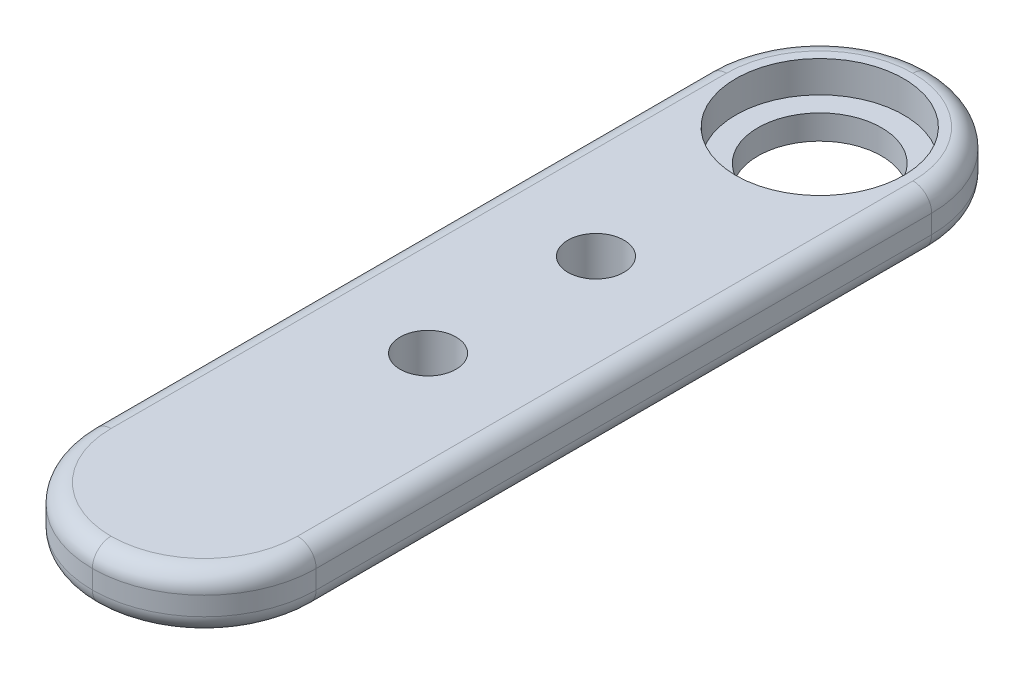
ISO-10303-21;
HEADER;
FILE_DESCRIPTION(('STEP AP214'),'2;1');
FILE_NAME('part.step','',(''),(''),'','','');
FILE_SCHEMA(('AUTOMOTIVE_DESIGN { 1 0 10303 214 1 1 1 1 }'));
ENDSEC;
DATA;
#1=APPLICATION_CONTEXT('core data for automotive mechanical design processes');
#2=APPLICATION_PROTOCOL_DEFINITION('international standard','automotive_design',2000,#1);
#3=PRODUCT_CONTEXT('',#1,'mechanical');
#4=PRODUCT('Part','Part','',(#3));
#5=PRODUCT_RELATED_PRODUCT_CATEGORY('part','',(#4));
#6=PRODUCT_DEFINITION_FORMATION('','',#4);
#7=PRODUCT_DEFINITION_CONTEXT('part definition',#1,'design');
#8=PRODUCT_DEFINITION('design','',#6,#7);
#9=PRODUCT_DEFINITION_SHAPE('','',#8);
#10=(LENGTH_UNIT() NAMED_UNIT(*) SI_UNIT(.MILLI.,.METRE.));
#11=(NAMED_UNIT(*) PLANE_ANGLE_UNIT() SI_UNIT($,.RADIAN.));
#12=(NAMED_UNIT(*) SI_UNIT($,.STERADIAN.) SOLID_ANGLE_UNIT());
#13=UNCERTAINTY_MEASURE_WITH_UNIT(LENGTH_MEASURE(1.E-05),#10,'distance_accuracy_value','');
#14=(GEOMETRIC_REPRESENTATION_CONTEXT(3) GLOBAL_UNCERTAINTY_ASSIGNED_CONTEXT((#13)) GLOBAL_UNIT_ASSIGNED_CONTEXT((#10,
#11,#12)) REPRESENTATION_CONTEXT('',''));
#15=CARTESIAN_POINT('',(0.,0.,0.));
#16=DIRECTION('',(0.,0.,1.));
#17=DIRECTION('',(1.,0.,0.));
#18=AXIS2_PLACEMENT_3D('',#15,#16,#17);
#19=CARTESIAN_POINT('',(0.,6.35,0.));
#20=DIRECTION('',(0.,-1.,0.));
#21=DIRECTION('',(0.,0.,-1.));
#22=AXIS2_PLACEMENT_3D('',#19,#20,#21);
#23=PLANE('',#22);
#24=CARTESIAN_POINT('',(0.,6.35,-34.925));
#25=DIRECTION('',(0.,1.,0.));
#26=DIRECTION('',(0.,0.,1.));
#27=AXIS2_PLACEMENT_3D('',#24,#25,#26);
#28=CIRCLE('',#27,9.52500000000001);
#29=CARTESIAN_POINT('',(0.,6.35,-25.4));
#30=VERTEX_POINT('',#29);
#31=EDGE_CURVE('E274',#30,#30,#28,.T.);
#32=ORIENTED_EDGE('',*,*,#31,.F.);
#33=EDGE_LOOP('',(#32));
#34=FACE_BOUND('',#33,.T.);
#35=CARTESIAN_POINT('',(0.,6.35,-34.925));
#36=DIRECTION('',(0.,-1.,0.));
#37=DIRECTION('',(0.,0.,-1.));
#38=AXIS2_PLACEMENT_3D('',#35,#36,#37);
#39=CIRCLE('',#38,10.5833333333333);
#40=CARTESIAN_POINT('',(10.5833333333333,6.35,-34.925));
#41=VERTEX_POINT('',#40);
#42=CARTESIAN_POINT('',(0.,6.35,-45.5083333333333));
#43=VERTEX_POINT('',#42);
#44=EDGE_CURVE('E50',#41,#43,#39,.F.);
#45=ORIENTED_EDGE('',*,*,#44,.T.);
#46=CARTESIAN_POINT('',(0.,6.35,-34.925));
#47=DIRECTION('',(0.,-1.,0.));
#48=DIRECTION('',(0.,0.,-1.));
#49=AXIS2_PLACEMENT_3D('',#46,#47,#48);
#50=CIRCLE('',#49,10.5833333333333);
#51=CARTESIAN_POINT('',(-10.5833333333333,6.35,-34.925));
#52=VERTEX_POINT('',#51);
#53=EDGE_CURVE('E183',#43,#52,#50,.F.);
#54=ORIENTED_EDGE('',*,*,#53,.T.);
#55=DIRECTION('',(0.,0.,1.));
#56=VECTOR('',#55,1.);
#57=CARTESIAN_POINT('',(-10.5833333333333,6.35,0.));
#58=LINE('',#57,#56);
#59=CARTESIAN_POINT('',(-10.5833333333333,6.35,34.925));
#60=VERTEX_POINT('',#59);
#61=EDGE_CURVE('E175',#52,#60,#58,.T.);
#62=ORIENTED_EDGE('',*,*,#61,.T.);
#63=CARTESIAN_POINT('',(0.,6.35,34.925));
#64=DIRECTION('',(0.,-1.,0.));
#65=DIRECTION('',(0.,0.,-1.));
#66=AXIS2_PLACEMENT_3D('',#63,#64,#65);
#67=CIRCLE('',#66,10.5833333333333);
#68=CARTESIAN_POINT('',(0.,6.35,45.5083333333333));
#69=VERTEX_POINT('',#68);
#70=EDGE_CURVE('E177',#60,#69,#67,.F.);
#71=ORIENTED_EDGE('',*,*,#70,.T.);
#72=CARTESIAN_POINT('',(0.,6.35,34.925));
#73=DIRECTION('',(0.,-1.,0.));
#74=DIRECTION('',(0.,0.,-1.));
#75=AXIS2_PLACEMENT_3D('',#72,#73,#74);
#76=CIRCLE('',#75,10.5833333333333);
#77=CARTESIAN_POINT('',(10.5833333333334,6.35,34.925));
#78=VERTEX_POINT('',#77);
#79=EDGE_CURVE('E179',#69,#78,#76,.F.);
#80=ORIENTED_EDGE('',*,*,#79,.T.);
#81=DIRECTION('',(0.,0.,-1.));
#82=VECTOR('',#81,1.);
#83=CARTESIAN_POINT('',(10.5833333333333,6.35,0.));
#84=LINE('',#83,#82);
#85=EDGE_CURVE('E55',#78,#41,#84,.T.);
#86=ORIENTED_EDGE('',*,*,#85,.T.);
#87=EDGE_LOOP('',(#45,#54,#62,#71,#80,#86));
#88=FACE_BOUND('',#87,.T.);
#89=CARTESIAN_POINT('',(0.,6.35,-9.52499999999999));
#90=DIRECTION('',(0.,1.,0.));
#91=DIRECTION('',(0.,0.,1.));
#92=AXIS2_PLACEMENT_3D('',#89,#90,#91);
#93=CIRCLE('',#92,3.175);
#94=CARTESIAN_POINT('',(0.,6.35,-6.34999999999999));
#95=VERTEX_POINT('',#94);
#96=EDGE_CURVE('E263',#95,#95,#93,.T.);
#97=ORIENTED_EDGE('',*,*,#96,.F.);
#98=EDGE_LOOP('',(#97));
#99=FACE_BOUND('',#98,.T.);
#100=CARTESIAN_POINT('',(0.,6.35,9.52500000000001));
#101=DIRECTION('',(0.,1.,0.));
#102=DIRECTION('',(0.,0.,1.));
#103=AXIS2_PLACEMENT_3D('',#100,#101,#102);
#104=CIRCLE('',#103,3.175);
#105=CARTESIAN_POINT('',(0.,6.35,12.7));
#106=VERTEX_POINT('',#105);
#107=EDGE_CURVE('E267',#106,#106,#104,.T.);
#108=ORIENTED_EDGE('',*,*,#107,.F.);
#109=EDGE_LOOP('',(#108));
#110=FACE_BOUND('',#109,.T.);
#111=ADVANCED_FACE('F33',(#34,#88,#99,#110),#23,.F.);
#112=CARTESIAN_POINT('',(0.,0.,0.));
#113=DIRECTION('',(0.,-1.,0.));
#114=DIRECTION('',(0.,0.,-1.));
#115=AXIS2_PLACEMENT_3D('',#112,#113,#114);
#116=PLANE('',#115);
#117=CARTESIAN_POINT('',(0.,0.,-34.925));
#118=DIRECTION('',(0.,1.,0.));
#119=DIRECTION('',(0.,0.,1.));
#120=AXIS2_PLACEMENT_3D('',#117,#118,#119);
#121=CIRCLE('',#120,7.01680789502882);
#122=CARTESIAN_POINT('',(0.,0.,-27.9081921049712));
#123=VERTEX_POINT('',#122);
#124=EDGE_CURVE('E282',#123,#123,#121,.T.);
#125=ORIENTED_EDGE('',*,*,#124,.T.);
#126=EDGE_LOOP('',(#125));
#127=FACE_BOUND('',#126,.T.);
#128=DIRECTION('',(0.,0.,-1.));
#129=VECTOR('',#128,1.);
#130=CARTESIAN_POINT('',(10.5833333333334,0.,34.925));
#131=LINE('',#130,#129);
#132=CARTESIAN_POINT('',(10.5833333333333,0.,-34.925));
#133=VERTEX_POINT('',#132);
#134=CARTESIAN_POINT('',(10.5833333333334,0.,34.925));
#135=VERTEX_POINT('',#134);
#136=EDGE_CURVE('E148',#133,#135,#131,.F.);
#137=ORIENTED_EDGE('',*,*,#136,.T.);
#138=CARTESIAN_POINT('',(0.,0.,34.925));
#139=DIRECTION('',(0.,-1.,0.));
#140=DIRECTION('',(0.,0.,-1.));
#141=AXIS2_PLACEMENT_3D('',#138,#139,#140);
#142=CIRCLE('',#141,10.5833333333333);
#143=CARTESIAN_POINT('',(0.,0.,45.5083333333333));
#144=VERTEX_POINT('',#143);
#145=EDGE_CURVE('E128',#135,#144,#142,.T.);
#146=ORIENTED_EDGE('',*,*,#145,.T.);
#147=CARTESIAN_POINT('',(0.,0.,34.925));
#148=DIRECTION('',(0.,-1.,0.));
#149=DIRECTION('',(0.,0.,-1.));
#150=AXIS2_PLACEMENT_3D('',#147,#148,#149);
#151=CIRCLE('',#150,10.5833333333333);
#152=CARTESIAN_POINT('',(-10.5833333333333,0.,34.925));
#153=VERTEX_POINT('',#152);
#154=EDGE_CURVE('E136',#144,#153,#151,.T.);
#155=ORIENTED_EDGE('',*,*,#154,.T.);
#156=DIRECTION('',(0.,0.,1.));
#157=VECTOR('',#156,1.);
#158=CARTESIAN_POINT('',(-10.5833333333333,0.,-34.925));
#159=LINE('',#158,#157);
#160=CARTESIAN_POINT('',(-10.5833333333333,0.,-34.925));
#161=VERTEX_POINT('',#160);
#162=EDGE_CURVE('E142',#153,#161,#159,.F.);
#163=ORIENTED_EDGE('',*,*,#162,.T.);
#164=CARTESIAN_POINT('',(0.,0.,-34.925));
#165=DIRECTION('',(0.,-1.,0.));
#166=DIRECTION('',(0.,0.,-1.));
#167=AXIS2_PLACEMENT_3D('',#164,#165,#166);
#168=CIRCLE('',#167,10.5833333333333);
#169=CARTESIAN_POINT('',(0.,0.,-45.5083333333333));
#170=VERTEX_POINT('',#169);
#171=EDGE_CURVE('E241',#161,#170,#168,.T.);
#172=ORIENTED_EDGE('',*,*,#171,.T.);
#173=CARTESIAN_POINT('',(0.,0.,-34.925));
#174=DIRECTION('',(0.,-1.,0.));
#175=DIRECTION('',(0.,0.,-1.));
#176=AXIS2_PLACEMENT_3D('',#173,#174,#175);
#177=CIRCLE('',#176,10.5833333333333);
#178=EDGE_CURVE('E153',#170,#133,#177,.T.);
#179=ORIENTED_EDGE('',*,*,#178,.T.);
#180=EDGE_LOOP('',(#137,#146,#155,#163,#172,#179));
#181=FACE_BOUND('',#180,.T.);
#182=CARTESIAN_POINT('',(0.,0.,-9.52499999999999));
#183=DIRECTION('',(0.,1.,0.));
#184=DIRECTION('',(0.,0.,1.));
#185=AXIS2_PLACEMENT_3D('',#182,#183,#184);
#186=CIRCLE('',#185,3.175);
#187=CARTESIAN_POINT('',(0.,0.,-6.34999999999999));
#188=VERTEX_POINT('',#187);
#189=EDGE_CURVE('E264',#188,#188,#186,.T.);
#190=ORIENTED_EDGE('',*,*,#189,.T.);
#191=EDGE_LOOP('',(#190));
#192=FACE_BOUND('',#191,.T.);
#193=CARTESIAN_POINT('',(0.,0.,9.52500000000001));
#194=DIRECTION('',(0.,1.,0.));
#195=DIRECTION('',(0.,0.,1.));
#196=AXIS2_PLACEMENT_3D('',#193,#194,#195);
#197=CIRCLE('',#196,3.175);
#198=CARTESIAN_POINT('',(0.,0.,12.7));
#199=VERTEX_POINT('',#198);
#200=EDGE_CURVE('E236',#199,#199,#197,.T.);
#201=ORIENTED_EDGE('',*,*,#200,.T.);
#202=EDGE_LOOP('',(#201));
#203=FACE_BOUND('',#202,.T.);
#204=ADVANCED_FACE('F145',(#127,#181,#192,#203),#116,.T.);
#205=CARTESIAN_POINT('',(12.7,6.35,47.625));
#206=DIRECTION('',(-1.,0.,0.));
#207=DIRECTION('',(0.,0.,1.));
#208=AXIS2_PLACEMENT_3D('',#205,#206,#207);
#209=PLANE('',#208);
#210=DIRECTION('',(0.,-1.,0.));
#211=VECTOR('',#210,1.);
#212=CARTESIAN_POINT('',(12.7,6.35,34.925));
#213=LINE('',#212,#211);
#214=CARTESIAN_POINT('',(12.7,4.23333333333333,34.925));
#215=VERTEX_POINT('',#214);
#216=CARTESIAN_POINT('',(12.7,2.11666666666667,34.925));
#217=VERTEX_POINT('',#216);
#218=EDGE_CURVE('E228',#215,#217,#213,.T.);
#219=ORIENTED_EDGE('',*,*,#218,.T.);
#220=DIRECTION('',(0.,0.,-1.));
#221=VECTOR('',#220,1.);
#222=CARTESIAN_POINT('',(12.7,2.11666666666667,-34.925));
#223=LINE('',#222,#221);
#224=CARTESIAN_POINT('',(12.7,2.11666666666667,-34.925));
#225=VERTEX_POINT('',#224);
#226=EDGE_CURVE('E160',#217,#225,#223,.T.);
#227=ORIENTED_EDGE('',*,*,#226,.T.);
#228=DIRECTION('',(0.,-1.,0.));
#229=VECTOR('',#228,1.);
#230=CARTESIAN_POINT('',(12.7,6.35,-34.925));
#231=LINE('',#230,#229);
#232=CARTESIAN_POINT('',(12.7,4.23333333333333,-34.925));
#233=VERTEX_POINT('',#232);
#234=EDGE_CURVE('E143',#225,#233,#231,.F.);
#235=ORIENTED_EDGE('',*,*,#234,.T.);
#236=DIRECTION('',(0.,0.,-1.));
#237=VECTOR('',#236,1.);
#238=CARTESIAN_POINT('',(12.7,4.23333333333333,47.625));
#239=LINE('',#238,#237);
#240=EDGE_CURVE('E158',#233,#215,#239,.F.);
#241=ORIENTED_EDGE('',*,*,#240,.T.);
#242=EDGE_LOOP('',(#219,#227,#235,#241));
#243=FACE_BOUND('',#242,.T.);
#244=ADVANCED_FACE('F255',(#243),#209,.F.);
#245=CARTESIAN_POINT('',(-12.7,6.35,47.625));
#246=DIRECTION('',(1.,0.,0.));
#247=DIRECTION('',(0.,0.,-1.));
#248=AXIS2_PLACEMENT_3D('',#245,#246,#247);
#249=PLANE('',#248);
#250=DIRECTION('',(0.,-1.,0.));
#251=VECTOR('',#250,1.);
#252=CARTESIAN_POINT('',(-12.7,6.35,-34.925));
#253=LINE('',#252,#251);
#254=CARTESIAN_POINT('',(-12.7,4.23333333333333,-34.925));
#255=VERTEX_POINT('',#254);
#256=CARTESIAN_POINT('',(-12.7,2.11666666666667,-34.925));
#257=VERTEX_POINT('',#256);
#258=EDGE_CURVE('E256',#255,#257,#253,.T.);
#259=ORIENTED_EDGE('',*,*,#258,.T.);
#260=DIRECTION('',(0.,0.,1.));
#261=VECTOR('',#260,1.);
#262=CARTESIAN_POINT('',(-12.7,2.11666666666667,34.925));
#263=LINE('',#262,#261);
#264=CARTESIAN_POINT('',(-12.7,2.11666666666667,34.925));
#265=VERTEX_POINT('',#264);
#266=EDGE_CURVE('E173',#257,#265,#263,.T.);
#267=ORIENTED_EDGE('',*,*,#266,.T.);
#268=DIRECTION('',(0.,-1.,0.));
#269=VECTOR('',#268,1.);
#270=CARTESIAN_POINT('',(-12.7,6.35,34.925));
#271=LINE('',#270,#269);
#272=CARTESIAN_POINT('',(-12.7,4.23333333333333,34.925));
#273=VERTEX_POINT('',#272);
#274=EDGE_CURVE('E259',#265,#273,#271,.F.);
#275=ORIENTED_EDGE('',*,*,#274,.T.);
#276=DIRECTION('',(0.,0.,1.));
#277=VECTOR('',#276,1.);
#278=CARTESIAN_POINT('',(-12.7,4.23333333333333,47.625));
#279=LINE('',#278,#277);
#280=EDGE_CURVE('E171',#273,#255,#279,.F.);
#281=ORIENTED_EDGE('',*,*,#280,.T.);
#282=EDGE_LOOP('',(#259,#267,#275,#281));
#283=FACE_BOUND('',#282,.T.);
#284=ADVANCED_FACE('F310',(#283),#249,.F.);
#285=CARTESIAN_POINT('',(0.,6.35,-9.52499999999999));
#286=DIRECTION('',(0.,-1.,0.));
#287=DIRECTION('',(0.,0.,-1.));
#288=AXIS2_PLACEMENT_3D('',#285,#286,#287);
#289=CYLINDRICAL_SURFACE('',#288,3.175);
#290=ORIENTED_EDGE('',*,*,#96,.T.);
#291=EDGE_LOOP('',(#290));
#292=FACE_BOUND('',#291,.T.);
#293=ORIENTED_EDGE('',*,*,#189,.F.);
#294=EDGE_LOOP('',(#293));
#295=FACE_BOUND('',#294,.T.);
#296=ADVANCED_FACE('F307',(#292,#295),#289,.F.);
#297=CARTESIAN_POINT('',(0.,6.35,9.52500000000001));
#298=DIRECTION('',(0.,-1.,0.));
#299=DIRECTION('',(0.,0.,-1.));
#300=AXIS2_PLACEMENT_3D('',#297,#298,#299);
#301=CYLINDRICAL_SURFACE('',#300,3.175);
#302=ORIENTED_EDGE('',*,*,#107,.T.);
#303=EDGE_LOOP('',(#302));
#304=FACE_BOUND('',#303,.T.);
#305=ORIENTED_EDGE('',*,*,#200,.F.);
#306=EDGE_LOOP('',(#305));
#307=FACE_BOUND('',#306,.T.);
#308=ADVANCED_FACE('F323',(#304,#307),#301,.F.);
#309=CARTESIAN_POINT('',(0.,6.35,-34.925));
#310=DIRECTION('',(0.,-1.,0.));
#311=DIRECTION('',(0.,0.,-1.));
#312=AXIS2_PLACEMENT_3D('',#309,#310,#311);
#313=CYLINDRICAL_SURFACE('',#312,12.7);
#314=ORIENTED_EDGE('',*,*,#234,.F.);
#315=CARTESIAN_POINT('',(0.,2.11666666666667,-34.925));
#316=DIRECTION('',(0.,-1.,0.));
#317=DIRECTION('',(0.,0.,-1.));
#318=AXIS2_PLACEMENT_3D('',#315,#316,#317);
#319=CIRCLE('',#318,12.7);
#320=CARTESIAN_POINT('',(0.,2.11666666666667,-47.625));
#321=VERTEX_POINT('',#320);
#322=EDGE_CURVE('E164',#225,#321,#319,.F.);
#323=ORIENTED_EDGE('',*,*,#322,.T.);
#324=DIRECTION('',(0.,-1.,0.));
#325=VECTOR('',#324,1.);
#326=CARTESIAN_POINT('',(0.,6.35,-47.625));
#327=LINE('',#326,#325);
#328=CARTESIAN_POINT('',(0.,4.23333333333333,-47.625));
#329=VERTEX_POINT('',#328);
#330=EDGE_CURVE('E233',#329,#321,#327,.T.);
#331=ORIENTED_EDGE('',*,*,#330,.F.);
#332=CARTESIAN_POINT('',(0.,4.23333333333333,-34.925));
#333=DIRECTION('',(0.,-1.,0.));
#334=DIRECTION('',(0.,0.,-1.));
#335=AXIS2_PLACEMENT_3D('',#332,#333,#334);
#336=CIRCLE('',#335,12.7);
#337=EDGE_CURVE('E162',#329,#233,#336,.T.);
#338=ORIENTED_EDGE('',*,*,#337,.T.);
#339=EDGE_LOOP('',(#314,#323,#331,#338));
#340=FACE_BOUND('',#339,.T.);
#341=ADVANCED_FACE('F319',(#340),#313,.T.);
#342=CARTESIAN_POINT('',(0.,6.35,-34.925));
#343=DIRECTION('',(0.,-1.,0.));
#344=DIRECTION('',(0.,0.,-1.));
#345=AXIS2_PLACEMENT_3D('',#342,#343,#344);
#346=CYLINDRICAL_SURFACE('',#345,12.7);
#347=ORIENTED_EDGE('',*,*,#330,.T.);
#348=CARTESIAN_POINT('',(0.,2.11666666666667,-34.925));
#349=DIRECTION('',(0.,-1.,0.));
#350=DIRECTION('',(0.,0.,-1.));
#351=AXIS2_PLACEMENT_3D('',#348,#349,#350);
#352=CIRCLE('',#351,12.7);
#353=EDGE_CURVE('E169',#321,#257,#352,.F.);
#354=ORIENTED_EDGE('',*,*,#353,.T.);
#355=ORIENTED_EDGE('',*,*,#258,.F.);
#356=CARTESIAN_POINT('',(0.,4.23333333333333,-34.925));
#357=DIRECTION('',(0.,-1.,0.));
#358=DIRECTION('',(0.,0.,-1.));
#359=AXIS2_PLACEMENT_3D('',#356,#357,#358);
#360=CIRCLE('',#359,12.7);
#361=EDGE_CURVE('E166',#255,#329,#360,.T.);
#362=ORIENTED_EDGE('',*,*,#361,.T.);
#363=EDGE_LOOP('',(#347,#354,#355,#362));
#364=FACE_BOUND('',#363,.T.);
#365=ADVANCED_FACE('F316',(#364),#346,.T.);
#366=CARTESIAN_POINT('',(0.,6.35,34.925));
#367=DIRECTION('',(0.,-1.,0.));
#368=DIRECTION('',(0.,0.,-1.));
#369=AXIS2_PLACEMENT_3D('',#366,#367,#368);
#370=CYLINDRICAL_SURFACE('',#369,12.7);
#371=DIRECTION('',(0.,-1.,0.));
#372=VECTOR('',#371,1.);
#373=CARTESIAN_POINT('',(0.,6.35,47.625));
#374=LINE('',#373,#372);
#375=CARTESIAN_POINT('',(0.,2.11666666666667,47.625));
#376=VERTEX_POINT('',#375);
#377=CARTESIAN_POINT('',(0.,4.23333333333333,47.625));
#378=VERTEX_POINT('',#377);
#379=EDGE_CURVE('E197',#376,#378,#374,.F.);
#380=ORIENTED_EDGE('',*,*,#379,.F.);
#381=CARTESIAN_POINT('',(0.,2.11666666666667,34.925));
#382=DIRECTION('',(0.,-1.,0.));
#383=DIRECTION('',(0.,0.,-1.));
#384=AXIS2_PLACEMENT_3D('',#381,#382,#383);
#385=CIRCLE('',#384,12.7);
#386=EDGE_CURVE('E130',#376,#217,#385,.F.);
#387=ORIENTED_EDGE('',*,*,#386,.T.);
#388=ORIENTED_EDGE('',*,*,#218,.F.);
#389=CARTESIAN_POINT('',(0.,4.23333333333333,34.925));
#390=DIRECTION('',(0.,-1.,0.));
#391=DIRECTION('',(0.,0.,-1.));
#392=AXIS2_PLACEMENT_3D('',#389,#390,#391);
#393=CIRCLE('',#392,12.7);
#394=EDGE_CURVE('E150',#215,#378,#393,.T.);
#395=ORIENTED_EDGE('',*,*,#394,.T.);
#396=EDGE_LOOP('',(#380,#387,#388,#395));
#397=FACE_BOUND('',#396,.T.);
#398=ADVANCED_FACE('F226',(#397),#370,.T.);
#399=CARTESIAN_POINT('',(0.,6.35,34.925));
#400=DIRECTION('',(0.,-1.,0.));
#401=DIRECTION('',(0.,0.,-1.));
#402=AXIS2_PLACEMENT_3D('',#399,#400,#401);
#403=CYLINDRICAL_SURFACE('',#402,12.7);
#404=ORIENTED_EDGE('',*,*,#379,.T.);
#405=CARTESIAN_POINT('',(0.,4.23333333333333,34.925));
#406=DIRECTION('',(0.,-1.,0.));
#407=DIRECTION('',(0.,0.,-1.));
#408=AXIS2_PLACEMENT_3D('',#405,#406,#407);
#409=CIRCLE('',#408,12.7);
#410=EDGE_CURVE('E11',#378,#273,#409,.T.);
#411=ORIENTED_EDGE('',*,*,#410,.T.);
#412=ORIENTED_EDGE('',*,*,#274,.F.);
#413=CARTESIAN_POINT('',(0.,2.11666666666667,34.925));
#414=DIRECTION('',(0.,-1.,0.));
#415=DIRECTION('',(0.,0.,-1.));
#416=AXIS2_PLACEMENT_3D('',#413,#414,#415);
#417=CIRCLE('',#416,12.7);
#418=EDGE_CURVE('E42',#265,#376,#417,.F.);
#419=ORIENTED_EDGE('',*,*,#418,.T.);
#420=EDGE_LOOP('',(#404,#411,#412,#419));
#421=FACE_BOUND('',#420,.T.);
#422=ADVANCED_FACE('F230',(#421),#403,.T.);
#423=CARTESIAN_POINT('',(0.,2.11666666666667,-34.925));
#424=DIRECTION('',(0.,-1.,0.));
#425=DIRECTION('',(0.,0.,-1.));
#426=AXIS2_PLACEMENT_3D('',#423,#424,#425);
#427=TOROIDAL_SURFACE('',#426,10.5833333333333,2.11666666666667);
#428=CARTESIAN_POINT('',(-10.5833333333333,2.11666666666667,-34.925));
#429=DIRECTION('',(0.,0.,1.));
#430=DIRECTION('',(1.,0.,0.));
#431=AXIS2_PLACEMENT_3D('',#428,#429,#430);
#432=CIRCLE('',#431,2.11666666666667);
#433=EDGE_CURVE('E191',#257,#161,#432,.T.);
#434=ORIENTED_EDGE('',*,*,#433,.F.);
#435=ORIENTED_EDGE('',*,*,#353,.F.);
#436=CARTESIAN_POINT('',(0.,2.11666666666667,-45.5083333333333));
#437=DIRECTION('',(1.,0.,0.));
#438=DIRECTION('',(0.,0.,-1.));
#439=AXIS2_PLACEMENT_3D('',#436,#437,#438);
#440=CIRCLE('',#439,2.11666666666667);
#441=EDGE_CURVE('E194',#170,#321,#440,.T.);
#442=ORIENTED_EDGE('',*,*,#441,.F.);
#443=ORIENTED_EDGE('',*,*,#171,.F.);
#444=EDGE_LOOP('',(#434,#435,#442,#443));
#445=FACE_BOUND('',#444,.T.);
#446=ADVANCED_FACE('F327',(#445),#427,.T.);
#447=CARTESIAN_POINT('',(0.,2.11666666666667,-34.925));
#448=DIRECTION('',(0.,-1.,0.));
#449=DIRECTION('',(0.,0.,-1.));
#450=AXIS2_PLACEMENT_3D('',#447,#448,#449);
#451=TOROIDAL_SURFACE('',#450,10.5833333333333,2.11666666666667);
#452=ORIENTED_EDGE('',*,*,#441,.T.);
#453=ORIENTED_EDGE('',*,*,#322,.F.);
#454=CARTESIAN_POINT('',(10.5833333333333,2.11666666666667,-34.925));
#455=DIRECTION('',(0.,0.,1.));
#456=DIRECTION('',(1.,0.,0.));
#457=AXIS2_PLACEMENT_3D('',#454,#455,#456);
#458=CIRCLE('',#457,2.11666666666667);
#459=EDGE_CURVE('E188',#133,#225,#458,.T.);
#460=ORIENTED_EDGE('',*,*,#459,.F.);
#461=ORIENTED_EDGE('',*,*,#178,.F.);
#462=EDGE_LOOP('',(#452,#453,#460,#461));
#463=FACE_BOUND('',#462,.T.);
#464=ADVANCED_FACE('F248',(#463),#451,.T.);
#465=CARTESIAN_POINT('',(-10.5833333333333,2.11666666666667,47.625));
#466=DIRECTION('',(0.,0.,-1.));
#467=DIRECTION('',(-1.,0.,0.));
#468=AXIS2_PLACEMENT_3D('',#465,#466,#467);
#469=CYLINDRICAL_SURFACE('',#468,2.11666666666667);
#470=ORIENTED_EDGE('',*,*,#433,.T.);
#471=ORIENTED_EDGE('',*,*,#162,.F.);
#472=CARTESIAN_POINT('',(-10.5833333333333,2.11666666666667,34.925));
#473=DIRECTION('',(0.,0.,1.));
#474=DIRECTION('',(1.,0.,0.));
#475=AXIS2_PLACEMENT_3D('',#472,#473,#474);
#476=CIRCLE('',#475,2.11666666666667);
#477=EDGE_CURVE('E139',#265,#153,#476,.T.);
#478=ORIENTED_EDGE('',*,*,#477,.F.);
#479=ORIENTED_EDGE('',*,*,#266,.F.);
#480=EDGE_LOOP('',(#470,#471,#478,#479));
#481=FACE_BOUND('',#480,.T.);
#482=ADVANCED_FACE('F336',(#481),#469,.T.);
#483=CARTESIAN_POINT('',(10.5833333333334,2.11666666666667,47.625));
#484=DIRECTION('',(0.,0.,1.));
#485=DIRECTION('',(1.,0.,0.));
#486=AXIS2_PLACEMENT_3D('',#483,#484,#485);
#487=CYLINDRICAL_SURFACE('',#486,2.11666666666667);
#488=ORIENTED_EDGE('',*,*,#459,.T.);
#489=ORIENTED_EDGE('',*,*,#226,.F.);
#490=CARTESIAN_POINT('',(10.5833333333334,2.11666666666667,34.925));
#491=DIRECTION('',(0.,0.,1.));
#492=DIRECTION('',(1.,0.,0.));
#493=AXIS2_PLACEMENT_3D('',#490,#491,#492);
#494=CIRCLE('',#493,2.11666666666667);
#495=EDGE_CURVE('E133',#135,#217,#494,.T.);
#496=ORIENTED_EDGE('',*,*,#495,.F.);
#497=ORIENTED_EDGE('',*,*,#136,.F.);
#498=EDGE_LOOP('',(#488,#489,#496,#497));
#499=FACE_BOUND('',#498,.T.);
#500=ADVANCED_FACE('F251',(#499),#487,.T.);
#501=CARTESIAN_POINT('',(0.,2.11666666666667,34.925));
#502=DIRECTION('',(0.,-1.,0.));
#503=DIRECTION('',(0.,0.,-1.));
#504=AXIS2_PLACEMENT_3D('',#501,#502,#503);
#505=TOROIDAL_SURFACE('',#504,10.5833333333333,2.11666666666667);
#506=ORIENTED_EDGE('',*,*,#477,.T.);
#507=ORIENTED_EDGE('',*,*,#154,.F.);
#508=CARTESIAN_POINT('',(0.,2.11666666666667,45.5083333333333));
#509=DIRECTION('',(1.,0.,0.));
#510=DIRECTION('',(0.,0.,-1.));
#511=AXIS2_PLACEMENT_3D('',#508,#509,#510);
#512=CIRCLE('',#511,2.11666666666667);
#513=EDGE_CURVE('E124',#376,#144,#512,.T.);
#514=ORIENTED_EDGE('',*,*,#513,.F.);
#515=ORIENTED_EDGE('',*,*,#418,.F.);
#516=EDGE_LOOP('',(#506,#507,#514,#515));
#517=FACE_BOUND('',#516,.T.);
#518=ADVANCED_FACE('F137',(#517),#505,.T.);
#519=CARTESIAN_POINT('',(0.,2.11666666666667,34.925));
#520=DIRECTION('',(0.,-1.,0.));
#521=DIRECTION('',(0.,0.,-1.));
#522=AXIS2_PLACEMENT_3D('',#519,#520,#521);
#523=TOROIDAL_SURFACE('',#522,10.5833333333333,2.11666666666667);
#524=ORIENTED_EDGE('',*,*,#495,.T.);
#525=ORIENTED_EDGE('',*,*,#386,.F.);
#526=ORIENTED_EDGE('',*,*,#513,.T.);
#527=ORIENTED_EDGE('',*,*,#145,.F.);
#528=EDGE_LOOP('',(#524,#525,#526,#527));
#529=FACE_BOUND('',#528,.T.);
#530=ADVANCED_FACE('F126',(#529),#523,.T.);
#531=CARTESIAN_POINT('',(0.,4.23333333333333,34.925));
#532=DIRECTION('',(0.,-1.,0.));
#533=DIRECTION('',(0.,0.,-1.));
#534=AXIS2_PLACEMENT_3D('',#531,#532,#533);
#535=TOROIDAL_SURFACE('',#534,10.5833333333333,2.11666666666667);
#536=CARTESIAN_POINT('',(0.,4.23333333333333,45.5083333333333));
#537=DIRECTION('',(-1.,0.,0.));
#538=DIRECTION('',(0.,0.,1.));
#539=AXIS2_PLACEMENT_3D('',#536,#537,#538);
#540=CIRCLE('',#539,2.11666666666667);
#541=EDGE_CURVE('E208',#378,#69,#540,.T.);
#542=ORIENTED_EDGE('',*,*,#541,.F.);
#543=ORIENTED_EDGE('',*,*,#394,.F.);
#544=CARTESIAN_POINT('',(10.5833333333334,4.23333333333333,34.925));
#545=DIRECTION('',(0.,0.,-1.));
#546=DIRECTION('',(-1.,0.,0.));
#547=AXIS2_PLACEMENT_3D('',#544,#545,#546);
#548=CIRCLE('',#547,2.11666666666667);
#549=EDGE_CURVE('E37',#78,#215,#548,.T.);
#550=ORIENTED_EDGE('',*,*,#549,.F.);
#551=ORIENTED_EDGE('',*,*,#79,.F.);
#552=EDGE_LOOP('',(#542,#543,#550,#551));
#553=FACE_BOUND('',#552,.T.);
#554=ADVANCED_FACE('F35',(#553),#535,.T.);
#555=CARTESIAN_POINT('',(10.5833333333333,4.23333333333333,0.));
#556=DIRECTION('',(0.,0.,-1.));
#557=DIRECTION('',(-1.,0.,0.));
#558=AXIS2_PLACEMENT_3D('',#555,#556,#557);
#559=CYLINDRICAL_SURFACE('',#558,2.11666666666667);
#560=ORIENTED_EDGE('',*,*,#549,.T.);
#561=ORIENTED_EDGE('',*,*,#240,.F.);
#562=CARTESIAN_POINT('',(10.5833333333333,4.23333333333333,-34.925));
#563=DIRECTION('',(0.,0.,-1.));
#564=DIRECTION('',(-1.,0.,0.));
#565=AXIS2_PLACEMENT_3D('',#562,#563,#564);
#566=CIRCLE('',#565,2.11666666666667);
#567=EDGE_CURVE('E206',#41,#233,#566,.T.);
#568=ORIENTED_EDGE('',*,*,#567,.F.);
#569=ORIENTED_EDGE('',*,*,#85,.F.);
#570=EDGE_LOOP('',(#560,#561,#568,#569));
#571=FACE_BOUND('',#570,.T.);
#572=ADVANCED_FACE('F218',(#571),#559,.T.);
#573=CARTESIAN_POINT('',(0.,4.23333333333333,34.925));
#574=DIRECTION('',(0.,-1.,0.));
#575=DIRECTION('',(0.,0.,-1.));
#576=AXIS2_PLACEMENT_3D('',#573,#574,#575);
#577=TOROIDAL_SURFACE('',#576,10.5833333333333,2.11666666666667);
#578=ORIENTED_EDGE('',*,*,#541,.T.);
#579=ORIENTED_EDGE('',*,*,#70,.F.);
#580=CARTESIAN_POINT('',(-10.5833333333333,4.23333333333333,34.925));
#581=DIRECTION('',(0.,0.,-1.));
#582=DIRECTION('',(-1.,0.,0.));
#583=AXIS2_PLACEMENT_3D('',#580,#581,#582);
#584=CIRCLE('',#583,2.11666666666667);
#585=EDGE_CURVE('E203',#273,#60,#584,.T.);
#586=ORIENTED_EDGE('',*,*,#585,.F.);
#587=ORIENTED_EDGE('',*,*,#410,.F.);
#588=EDGE_LOOP('',(#578,#579,#586,#587));
#589=FACE_BOUND('',#588,.T.);
#590=ADVANCED_FACE('F356',(#589),#577,.T.);
#591=CARTESIAN_POINT('',(0.,4.23333333333333,-34.925));
#592=DIRECTION('',(0.,-1.,0.));
#593=DIRECTION('',(0.,0.,-1.));
#594=AXIS2_PLACEMENT_3D('',#591,#592,#593);
#595=TOROIDAL_SURFACE('',#594,10.5833333333333,2.11666666666667);
#596=ORIENTED_EDGE('',*,*,#567,.T.);
#597=ORIENTED_EDGE('',*,*,#337,.F.);
#598=CARTESIAN_POINT('',(0.,4.23333333333333,-45.5083333333333));
#599=DIRECTION('',(-1.,0.,0.));
#600=DIRECTION('',(0.,0.,1.));
#601=AXIS2_PLACEMENT_3D('',#598,#599,#600);
#602=CIRCLE('',#601,2.11666666666667);
#603=EDGE_CURVE('E200',#43,#329,#602,.T.);
#604=ORIENTED_EDGE('',*,*,#603,.F.);
#605=ORIENTED_EDGE('',*,*,#44,.F.);
#606=EDGE_LOOP('',(#596,#597,#604,#605));
#607=FACE_BOUND('',#606,.T.);
#608=ADVANCED_FACE('F352',(#607),#595,.T.);
#609=CARTESIAN_POINT('',(-10.5833333333333,4.23333333333333,0.));
#610=DIRECTION('',(0.,0.,1.));
#611=DIRECTION('',(1.,0.,0.));
#612=AXIS2_PLACEMENT_3D('',#609,#610,#611);
#613=CYLINDRICAL_SURFACE('',#612,2.11666666666667);
#614=ORIENTED_EDGE('',*,*,#585,.T.);
#615=ORIENTED_EDGE('',*,*,#61,.F.);
#616=CARTESIAN_POINT('',(-10.5833333333333,4.23333333333333,-34.925));
#617=DIRECTION('',(0.,0.,-1.));
#618=DIRECTION('',(-1.,0.,0.));
#619=AXIS2_PLACEMENT_3D('',#616,#617,#618);
#620=CIRCLE('',#619,2.11666666666667);
#621=EDGE_CURVE('E198',#255,#52,#620,.T.);
#622=ORIENTED_EDGE('',*,*,#621,.F.);
#623=ORIENTED_EDGE('',*,*,#280,.F.);
#624=EDGE_LOOP('',(#614,#615,#622,#623));
#625=FACE_BOUND('',#624,.T.);
#626=ADVANCED_FACE('F348',(#625),#613,.T.);
#627=CARTESIAN_POINT('',(0.,4.23333333333333,-34.925));
#628=DIRECTION('',(0.,-1.,0.));
#629=DIRECTION('',(0.,0.,-1.));
#630=AXIS2_PLACEMENT_3D('',#627,#628,#629);
#631=TOROIDAL_SURFACE('',#630,10.5833333333333,2.11666666666667);
#632=ORIENTED_EDGE('',*,*,#603,.T.);
#633=ORIENTED_EDGE('',*,*,#361,.F.);
#634=ORIENTED_EDGE('',*,*,#621,.T.);
#635=ORIENTED_EDGE('',*,*,#53,.F.);
#636=EDGE_LOOP('',(#632,#633,#634,#635));
#637=FACE_BOUND('',#636,.T.);
#638=ADVANCED_FACE('F345',(#637),#631,.T.);
#639=CARTESIAN_POINT('',(0.,2.778125,-34.925));
#640=DIRECTION('',(0.,1.,0.));
#641=DIRECTION('',(0.,0.,1.));
#642=AXIS2_PLACEMENT_3D('',#639,#640,#641);
#643=CYLINDRICAL_SURFACE('',#642,9.52500000000001);
#644=CARTESIAN_POINT('',(0.,2.778125,-34.925));
#645=DIRECTION('',(0.,1.,0.));
#646=DIRECTION('',(0.,0.,1.));
#647=AXIS2_PLACEMENT_3D('',#644,#645,#646);
#648=CIRCLE('',#647,9.52500000000001);
#649=CARTESIAN_POINT('',(0.,2.778125,-25.4));
#650=VERTEX_POINT('',#649);
#651=EDGE_CURVE('E201',#650,#650,#648,.T.);
#652=ORIENTED_EDGE('',*,*,#651,.F.);
#653=EDGE_LOOP('',(#652));
#654=FACE_BOUND('',#653,.T.);
#655=ORIENTED_EDGE('',*,*,#31,.T.);
#656=EDGE_LOOP('',(#655));
#657=FACE_BOUND('',#656,.T.);
#658=ADVANCED_FACE('F295',(#654,#657),#643,.F.);
#659=CARTESIAN_POINT('',(0.,2.778125,-34.925));
#660=DIRECTION('',(0.,1.,0.));
#661=DIRECTION('',(0.,0.,1.));
#662=AXIS2_PLACEMENT_3D('',#659,#660,#661);
#663=PLANE('',#662);
#664=CARTESIAN_POINT('',(0.,2.778125,-34.925));
#665=DIRECTION('',(0.,1.,0.));
#666=DIRECTION('',(0.,0.,1.));
#667=AXIS2_PLACEMENT_3D('',#664,#665,#666);
#668=CIRCLE('',#667,7.01680789502882);
#669=CARTESIAN_POINT('',(0.,2.778125,-27.9081921049712));
#670=VERTEX_POINT('',#669);
#671=EDGE_CURVE('E277',#670,#670,#668,.T.);
#672=ORIENTED_EDGE('',*,*,#671,.F.);
#673=EDGE_LOOP('',(#672));
#674=FACE_BOUND('',#673,.T.);
#675=ORIENTED_EDGE('',*,*,#651,.T.);
#676=EDGE_LOOP('',(#675));
#677=FACE_BOUND('',#676,.T.);
#678=ADVANCED_FACE('F289',(#674,#677),#663,.T.);
#679=CARTESIAN_POINT('',(0.,0.,-34.925));
#680=DIRECTION('',(0.,1.,0.));
#681=DIRECTION('',(0.,0.,1.));
#682=AXIS2_PLACEMENT_3D('',#679,#680,#681);
#683=CYLINDRICAL_SURFACE('',#682,7.01680789502882);
#684=ORIENTED_EDGE('',*,*,#671,.T.);
#685=EDGE_LOOP('',(#684));
#686=FACE_BOUND('',#685,.T.);
#687=ORIENTED_EDGE('',*,*,#124,.F.);
#688=EDGE_LOOP('',(#687));
#689=FACE_BOUND('',#688,.T.);
#690=ADVANCED_FACE('F287',(#686,#689),#683,.F.);
#691=CLOSED_SHELL('',(#111,#204,#244,#284,#296,#308,#341,#365,#398,#422,#446,#464,#482,#500,
#518,#530,#554,#572,#590,#608,#626,#638,#658,#678,#690));
#692=MANIFOLD_SOLID_BREP('B2',#691);
#693=ADVANCED_BREP_SHAPE_REPRESENTATION('',(#18,#692),#14);
#694=SHAPE_DEFINITION_REPRESENTATION(#9,#693);
ENDSEC;
END-ISO-10303-21;
